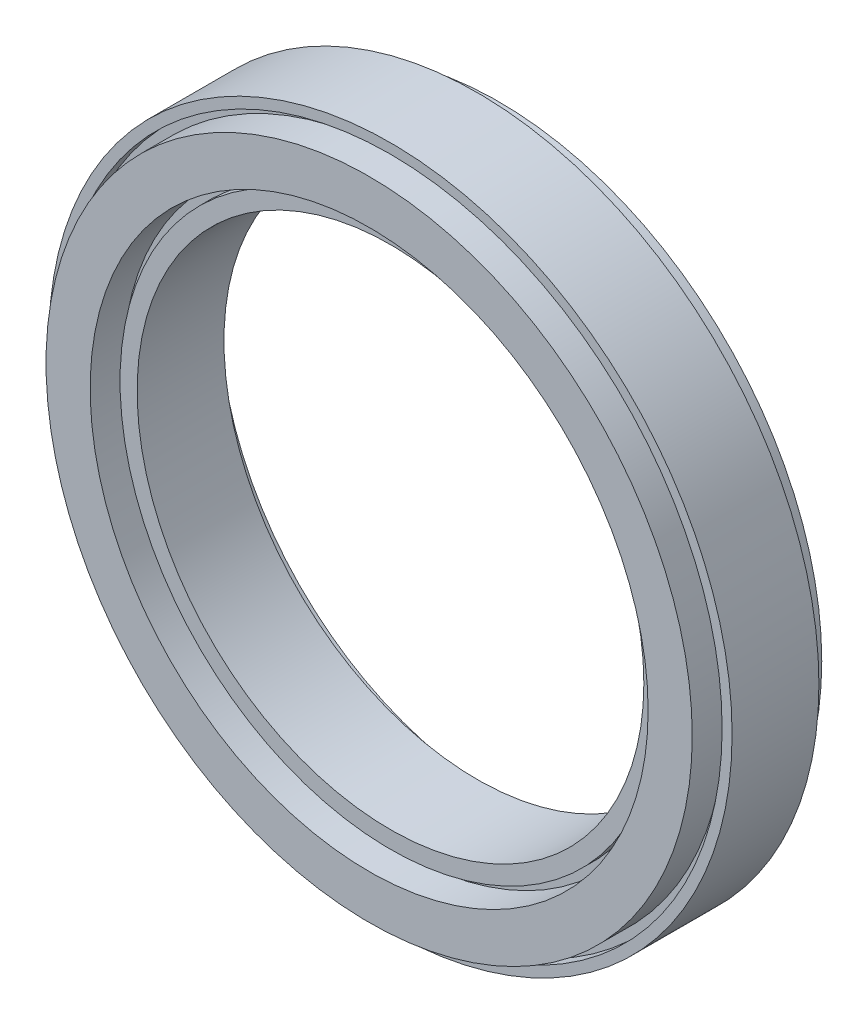
ISO-10303-21;
HEADER;
FILE_DESCRIPTION(('STEP AP214'),'2;1');
FILE_NAME('part.step','',(''),(''),'','','');
FILE_SCHEMA(('AUTOMOTIVE_DESIGN { 1 0 10303 214 1 1 1 1 }'));
ENDSEC;
DATA;
#1=APPLICATION_CONTEXT('core data for automotive mechanical design processes');
#2=APPLICATION_PROTOCOL_DEFINITION('international standard','automotive_design',2000,#1);
#3=PRODUCT_CONTEXT('',#1,'mechanical');
#4=PRODUCT('Part','Part','',(#3));
#5=PRODUCT_RELATED_PRODUCT_CATEGORY('part','',(#4));
#6=PRODUCT_DEFINITION_FORMATION('','',#4);
#7=PRODUCT_DEFINITION_CONTEXT('part definition',#1,'design');
#8=PRODUCT_DEFINITION('design','',#6,#7);
#9=PRODUCT_DEFINITION_SHAPE('','',#8);
#10=(LENGTH_UNIT() NAMED_UNIT(*) SI_UNIT(.MILLI.,.METRE.));
#11=(NAMED_UNIT(*) PLANE_ANGLE_UNIT() SI_UNIT($,.RADIAN.));
#12=(NAMED_UNIT(*) SI_UNIT($,.STERADIAN.) SOLID_ANGLE_UNIT());
#13=UNCERTAINTY_MEASURE_WITH_UNIT(LENGTH_MEASURE(1.E-05),#10,'distance_accuracy_value','');
#14=(GEOMETRIC_REPRESENTATION_CONTEXT(3) GLOBAL_UNCERTAINTY_ASSIGNED_CONTEXT((#13)) GLOBAL_UNIT_ASSIGNED_CONTEXT((#10,
#11,#12)) REPRESENTATION_CONTEXT('',''));
#15=CARTESIAN_POINT('',(0.,0.,0.));
#16=DIRECTION('',(0.,0.,1.));
#17=DIRECTION('',(1.,0.,0.));
#18=AXIS2_PLACEMENT_3D('',#15,#16,#17);
#19=CARTESIAN_POINT('',(0.,0.,-2.25));
#20=DIRECTION('',(0.,0.,-1.));
#21=DIRECTION('',(1.,0.,0.));
#22=AXIS2_PLACEMENT_3D('',#19,#20,#21);
#23=PLANE('',#22);
#24=CARTESIAN_POINT('',(0.,0.,-2.25));
#25=DIRECTION('',(0.,0.,1.));
#26=DIRECTION('',(1.,0.,0.));
#27=AXIS2_PLACEMENT_3D('',#24,#25,#26);
#28=CIRCLE('',#27,19.);
#29=CARTESIAN_POINT('',(19.,0.,-2.25));
#30=VERTEX_POINT('',#29);
#31=EDGE_CURVE('E84',#30,#30,#28,.T.);
#32=ORIENTED_EDGE('',*,*,#31,.T.);
#33=EDGE_LOOP('',(#32));
#34=FACE_BOUND('',#33,.T.);
#35=CARTESIAN_POINT('',(0.,0.,-2.25));
#36=DIRECTION('',(0.,0.,1.));
#37=DIRECTION('',(1.,0.,0.));
#38=AXIS2_PLACEMENT_3D('',#35,#36,#37);
#39=CIRCLE('',#38,19.6);
#40=CARTESIAN_POINT('',(19.6,0.,-2.25));
#41=VERTEX_POINT('',#40);
#42=EDGE_CURVE('E96',#41,#41,#39,.T.);
#43=ORIENTED_EDGE('',*,*,#42,.F.);
#44=EDGE_LOOP('',(#43));
#45=FACE_BOUND('',#44,.T.);
#46=ADVANCED_FACE('F33',(#34,#45),#23,.T.);
#47=CARTESIAN_POINT('',(0.,0.,-3.05));
#48=DIRECTION('',(0.,0.,1.));
#49=DIRECTION('',(1.,0.,0.));
#50=AXIS2_PLACEMENT_3D('',#47,#48,#49);
#51=PLANE('',#50);
#52=CARTESIAN_POINT('',(0.,0.,-3.05));
#53=DIRECTION('',(0.,0.,1.));
#54=DIRECTION('',(1.,0.,0.));
#55=AXIS2_PLACEMENT_3D('',#52,#53,#54);
#56=CIRCLE('',#55,17.8);
#57=CARTESIAN_POINT('',(17.8,0.,-3.05));
#58=VERTEX_POINT('',#57);
#59=EDGE_CURVE('E54',#58,#58,#56,.T.);
#60=ORIENTED_EDGE('',*,*,#59,.T.);
#61=EDGE_LOOP('',(#60));
#62=FACE_BOUND('',#61,.T.);
#63=CARTESIAN_POINT('',(0.,0.,-3.05));
#64=DIRECTION('',(0.,0.,1.));
#65=DIRECTION('',(1.,0.,0.));
#66=AXIS2_PLACEMENT_3D('',#63,#64,#65);
#67=CIRCLE('',#66,19.);
#68=CARTESIAN_POINT('',(19.,0.,-3.05));
#69=VERTEX_POINT('',#68);
#70=EDGE_CURVE('E87',#69,#69,#67,.T.);
#71=ORIENTED_EDGE('',*,*,#70,.F.);
#72=EDGE_LOOP('',(#71));
#73=FACE_BOUND('',#72,.T.);
#74=ADVANCED_FACE('F112',(#62,#73),#51,.F.);
#75=CARTESIAN_POINT('',(0.,0.,2.25));
#76=DIRECTION('',(0.,0.,1.));
#77=DIRECTION('',(1.,0.,0.));
#78=AXIS2_PLACEMENT_3D('',#75,#76,#77);
#79=PLANE('',#78);
#80=CARTESIAN_POINT('',(0.,0.,2.25));
#81=DIRECTION('',(0.,0.,1.));
#82=DIRECTION('',(1.,0.,0.));
#83=AXIS2_PLACEMENT_3D('',#80,#81,#82);
#84=CIRCLE('',#83,19.);
#85=CARTESIAN_POINT('',(19.,0.,2.25));
#86=VERTEX_POINT('',#85);
#87=EDGE_CURVE('E63',#86,#86,#84,.T.);
#88=ORIENTED_EDGE('',*,*,#87,.F.);
#89=EDGE_LOOP('',(#88));
#90=FACE_BOUND('',#89,.T.);
#91=CARTESIAN_POINT('',(0.,0.,2.25));
#92=DIRECTION('',(0.,0.,1.));
#93=DIRECTION('',(1.,0.,0.));
#94=AXIS2_PLACEMENT_3D('',#91,#92,#93);
#95=CIRCLE('',#94,19.6);
#96=CARTESIAN_POINT('',(19.6,0.,2.25));
#97=VERTEX_POINT('',#96);
#98=EDGE_CURVE('E40',#97,#97,#95,.F.);
#99=ORIENTED_EDGE('',*,*,#98,.F.);
#100=EDGE_LOOP('',(#99));
#101=FACE_BOUND('',#100,.T.);
#102=ADVANCED_FACE('F119',(#90,#101),#79,.T.);
#103=CARTESIAN_POINT('',(0.,0.,3.05));
#104=DIRECTION('',(0.,0.,1.));
#105=DIRECTION('',(1.,0.,0.));
#106=AXIS2_PLACEMENT_3D('',#103,#104,#105);
#107=PLANE('',#106);
#108=CARTESIAN_POINT('',(0.,0.,3.05));
#109=DIRECTION('',(0.,0.,1.));
#110=DIRECTION('',(1.,0.,0.));
#111=AXIS2_PLACEMENT_3D('',#108,#109,#110);
#112=CIRCLE('',#111,17.8);
#113=CARTESIAN_POINT('',(17.8,0.,3.05));
#114=VERTEX_POINT('',#113);
#115=EDGE_CURVE('E52',#114,#114,#112,.T.);
#116=ORIENTED_EDGE('',*,*,#115,.F.);
#117=EDGE_LOOP('',(#116));
#118=FACE_BOUND('',#117,.T.);
#119=CARTESIAN_POINT('',(0.,0.,3.05));
#120=DIRECTION('',(0.,0.,1.));
#121=DIRECTION('',(1.,0.,0.));
#122=AXIS2_PLACEMENT_3D('',#119,#120,#121);
#123=CIRCLE('',#122,19.);
#124=CARTESIAN_POINT('',(19.,0.,3.05));
#125=VERTEX_POINT('',#124);
#126=EDGE_CURVE('E66',#125,#125,#123,.T.);
#127=ORIENTED_EDGE('',*,*,#126,.T.);
#128=EDGE_LOOP('',(#127));
#129=FACE_BOUND('',#128,.T.);
#130=ADVANCED_FACE('F159',(#118,#129),#107,.T.);
#131=CARTESIAN_POINT('',(0.,0.,3.05));
#132=DIRECTION('',(0.,0.,1.));
#133=DIRECTION('',(1.,0.,0.));
#134=AXIS2_PLACEMENT_3D('',#131,#132,#133);
#135=CIRCLE('',#134,23.3);
#136=CARTESIAN_POINT('',(23.3,0.,3.05));
#137=VERTEX_POINT('',#136);
#138=EDGE_CURVE('E60',#137,#137,#135,.T.);
#139=ORIENTED_EDGE('',*,*,#138,.F.);
#140=EDGE_LOOP('',(#139));
#141=FACE_BOUND('',#140,.T.);
#142=CARTESIAN_POINT('',(0.,0.,3.05));
#143=DIRECTION('',(0.,0.,1.));
#144=DIRECTION('',(1.,0.,0.));
#145=AXIS2_PLACEMENT_3D('',#142,#143,#144);
#146=CIRCLE('',#145,24.);
#147=CARTESIAN_POINT('',(24.,0.,3.05));
#148=VERTEX_POINT('',#147);
#149=EDGE_CURVE('E44',#148,#148,#146,.T.);
#150=ORIENTED_EDGE('',*,*,#149,.T.);
#151=EDGE_LOOP('',(#150));
#152=FACE_BOUND('',#151,.T.);
#153=ADVANCED_FACE('F144',(#141,#152),#107,.T.);
#154=CARTESIAN_POINT('',(0.,0.,-3.05));
#155=DIRECTION('',(0.,0.,1.));
#156=DIRECTION('',(1.,0.,0.));
#157=AXIS2_PLACEMENT_3D('',#154,#155,#156);
#158=CIRCLE('',#157,23.3);
#159=CARTESIAN_POINT('',(23.3,0.,-3.05));
#160=VERTEX_POINT('',#159);
#161=EDGE_CURVE('E81',#160,#160,#158,.T.);
#162=ORIENTED_EDGE('',*,*,#161,.T.);
#163=EDGE_LOOP('',(#162));
#164=FACE_BOUND('',#163,.T.);
#165=CARTESIAN_POINT('',(0.,0.,-3.05));
#166=DIRECTION('',(0.,0.,1.));
#167=DIRECTION('',(1.,0.,0.));
#168=AXIS2_PLACEMENT_3D('',#165,#166,#167);
#169=CIRCLE('',#168,24.);
#170=CARTESIAN_POINT('',(24.,0.,-3.05));
#171=VERTEX_POINT('',#170);
#172=EDGE_CURVE('E48',#171,#171,#169,.T.);
#173=ORIENTED_EDGE('',*,*,#172,.F.);
#174=EDGE_LOOP('',(#173));
#175=FACE_BOUND('',#174,.T.);
#176=ADVANCED_FACE('F121',(#164,#175),#51,.F.);
#177=CARTESIAN_POINT('',(0.,0.,3.05));
#178=DIRECTION('',(0.,0.,-1.));
#179=DIRECTION('',(-1.,0.,0.));
#180=AXIS2_PLACEMENT_3D('',#177,#178,#179);
#181=CYLINDRICAL_SURFACE('',#180,24.);
#182=ORIENTED_EDGE('',*,*,#149,.F.);
#183=EDGE_LOOP('',(#182));
#184=FACE_BOUND('',#183,.T.);
#185=ORIENTED_EDGE('',*,*,#172,.T.);
#186=EDGE_LOOP('',(#185));
#187=FACE_BOUND('',#186,.T.);
#188=ADVANCED_FACE('F35',(#184,#187),#181,.T.);
#189=CARTESIAN_POINT('',(0.,0.,3.05));
#190=DIRECTION('',(0.,0.,-1.));
#191=DIRECTION('',(-1.,0.,0.));
#192=AXIS2_PLACEMENT_3D('',#189,#190,#191);
#193=CYLINDRICAL_SURFACE('',#192,17.8);
#194=ORIENTED_EDGE('',*,*,#115,.T.);
#195=EDGE_LOOP('',(#194));
#196=FACE_BOUND('',#195,.T.);
#197=ORIENTED_EDGE('',*,*,#59,.F.);
#198=EDGE_LOOP('',(#197));
#199=FACE_BOUND('',#198,.T.);
#200=ADVANCED_FACE('F148',(#196,#199),#193,.F.);
#201=CARTESIAN_POINT('',(0.,0.,2.25));
#202=DIRECTION('',(0.,0.,1.));
#203=DIRECTION('',(1.,0.,0.));
#204=AXIS2_PLACEMENT_3D('',#201,#202,#203);
#205=CYLINDRICAL_SURFACE('',#204,23.3);
#206=CARTESIAN_POINT('',(0.,0.,2.25));
#207=DIRECTION('',(0.,0.,1.));
#208=DIRECTION('',(1.,0.,0.));
#209=AXIS2_PLACEMENT_3D('',#206,#207,#208);
#210=CIRCLE('',#209,23.3);
#211=CARTESIAN_POINT('',(23.3,0.,2.25));
#212=VERTEX_POINT('',#211);
#213=EDGE_CURVE('E57',#212,#212,#210,.T.);
#214=ORIENTED_EDGE('',*,*,#213,.F.);
#215=EDGE_LOOP('',(#214));
#216=FACE_BOUND('',#215,.T.);
#217=ORIENTED_EDGE('',*,*,#138,.T.);
#218=EDGE_LOOP('',(#217));
#219=FACE_BOUND('',#218,.T.);
#220=ADVANCED_FACE('F153',(#216,#219),#205,.F.);
#221=CARTESIAN_POINT('',(0.,0.,2.25));
#222=DIRECTION('',(0.,0.,1.));
#223=DIRECTION('',(1.,0.,0.));
#224=AXIS2_PLACEMENT_3D('',#221,#222,#223);
#225=CIRCLE('',#224,22.7);
#226=CARTESIAN_POINT('',(22.7,0.,2.25));
#227=VERTEX_POINT('',#226);
#228=EDGE_CURVE('E72',#227,#227,#225,.T.);
#229=ORIENTED_EDGE('',*,*,#228,.F.);
#230=EDGE_LOOP('',(#229));
#231=FACE_BOUND('',#230,.T.);
#232=ORIENTED_EDGE('',*,*,#213,.T.);
#233=EDGE_LOOP('',(#232));
#234=FACE_BOUND('',#233,.T.);
#235=ADVANCED_FACE('F170',(#231,#234),#79,.T.);
#236=CARTESIAN_POINT('',(0.,0.,2.25));
#237=DIRECTION('',(0.,0.,1.));
#238=DIRECTION('',(1.,0.,0.));
#239=AXIS2_PLACEMENT_3D('',#236,#237,#238);
#240=CYLINDRICAL_SURFACE('',#239,19.);
#241=ORIENTED_EDGE('',*,*,#87,.T.);
#242=EDGE_LOOP('',(#241));
#243=FACE_BOUND('',#242,.T.);
#244=ORIENTED_EDGE('',*,*,#126,.F.);
#245=EDGE_LOOP('',(#244));
#246=FACE_BOUND('',#245,.T.);
#247=ADVANCED_FACE('F174',(#243,#246),#240,.T.);
#248=CARTESIAN_POINT('',(0.,0.,4.55));
#249=DIRECTION('',(0.,0.,1.));
#250=DIRECTION('',(1.,0.,0.));
#251=AXIS2_PLACEMENT_3D('',#248,#249,#250);
#252=PLANE('',#251);
#253=CARTESIAN_POINT('',(0.,0.,4.55));
#254=DIRECTION('',(0.,0.,1.));
#255=DIRECTION('',(1.,0.,0.));
#256=AXIS2_PLACEMENT_3D('',#253,#254,#255);
#257=CIRCLE('',#256,22.7);
#258=CARTESIAN_POINT('',(22.7,0.,4.55));
#259=VERTEX_POINT('',#258);
#260=EDGE_CURVE('E69',#259,#259,#257,.T.);
#261=ORIENTED_EDGE('',*,*,#260,.T.);
#262=EDGE_LOOP('',(#261));
#263=FACE_BOUND('',#262,.T.);
#264=CARTESIAN_POINT('',(0.,0.,4.55));
#265=DIRECTION('',(0.,0.,1.));
#266=DIRECTION('',(1.,0.,0.));
#267=AXIS2_PLACEMENT_3D('',#264,#265,#266);
#268=CIRCLE('',#267,19.6);
#269=CARTESIAN_POINT('',(19.6,0.,4.55));
#270=VERTEX_POINT('',#269);
#271=EDGE_CURVE('E75',#270,#270,#268,.T.);
#272=ORIENTED_EDGE('',*,*,#271,.F.);
#273=EDGE_LOOP('',(#272));
#274=FACE_BOUND('',#273,.T.);
#275=ADVANCED_FACE('F178',(#263,#274),#252,.T.);
#276=CARTESIAN_POINT('',(0.,0.,4.55));
#277=DIRECTION('',(0.,0.,-1.));
#278=DIRECTION('',(-1.,0.,0.));
#279=AXIS2_PLACEMENT_3D('',#276,#277,#278);
#280=CYLINDRICAL_SURFACE('',#279,22.7);
#281=ORIENTED_EDGE('',*,*,#260,.F.);
#282=EDGE_LOOP('',(#281));
#283=FACE_BOUND('',#282,.T.);
#284=ORIENTED_EDGE('',*,*,#228,.T.);
#285=EDGE_LOOP('',(#284));
#286=FACE_BOUND('',#285,.T.);
#287=ADVANCED_FACE('F134',(#283,#286),#280,.T.);
#288=CARTESIAN_POINT('',(0.,0.,4.55));
#289=DIRECTION('',(0.,0.,-1.));
#290=DIRECTION('',(-1.,0.,0.));
#291=AXIS2_PLACEMENT_3D('',#288,#289,#290);
#292=CYLINDRICAL_SURFACE('',#291,19.6);
#293=ORIENTED_EDGE('',*,*,#271,.T.);
#294=EDGE_LOOP('',(#293));
#295=FACE_BOUND('',#294,.T.);
#296=ORIENTED_EDGE('',*,*,#98,.T.);
#297=EDGE_LOOP('',(#296));
#298=FACE_BOUND('',#297,.T.);
#299=ADVANCED_FACE('F126',(#295,#298),#292,.F.);
#300=CARTESIAN_POINT('',(0.,0.,-2.25));
#301=DIRECTION('',(0.,0.,-1.));
#302=DIRECTION('',(-1.,0.,0.));
#303=AXIS2_PLACEMENT_3D('',#300,#301,#302);
#304=CIRCLE('',#303,22.7);
#305=CARTESIAN_POINT('',(-22.7,0.,-2.25));
#306=VERTEX_POINT('',#305);
#307=EDGE_CURVE('E10',#306,#306,#304,.T.);
#308=ORIENTED_EDGE('',*,*,#307,.F.);
#309=EDGE_LOOP('',(#308));
#310=FACE_BOUND('',#309,.T.);
#311=CARTESIAN_POINT('',(0.,0.,-2.25));
#312=DIRECTION('',(0.,0.,1.));
#313=DIRECTION('',(1.,0.,0.));
#314=AXIS2_PLACEMENT_3D('',#311,#312,#313);
#315=CIRCLE('',#314,23.3);
#316=CARTESIAN_POINT('',(23.3,0.,-2.25));
#317=VERTEX_POINT('',#316);
#318=EDGE_CURVE('E80',#317,#317,#315,.T.);
#319=ORIENTED_EDGE('',*,*,#318,.F.);
#320=EDGE_LOOP('',(#319));
#321=FACE_BOUND('',#320,.T.);
#322=ADVANCED_FACE('F115',(#310,#321),#23,.T.);
#323=CARTESIAN_POINT('',(0.,0.,-2.25));
#324=DIRECTION('',(0.,0.,-1.));
#325=DIRECTION('',(-1.,0.,0.));
#326=AXIS2_PLACEMENT_3D('',#323,#324,#325);
#327=CYLINDRICAL_SURFACE('',#326,23.3);
#328=ORIENTED_EDGE('',*,*,#318,.T.);
#329=EDGE_LOOP('',(#328));
#330=FACE_BOUND('',#329,.T.);
#331=ORIENTED_EDGE('',*,*,#161,.F.);
#332=EDGE_LOOP('',(#331));
#333=FACE_BOUND('',#332,.T.);
#334=ADVANCED_FACE('F125',(#330,#333),#327,.F.);
#335=CARTESIAN_POINT('',(0.,0.,-2.25));
#336=DIRECTION('',(0.,0.,-1.));
#337=DIRECTION('',(-1.,0.,0.));
#338=AXIS2_PLACEMENT_3D('',#335,#336,#337);
#339=CYLINDRICAL_SURFACE('',#338,19.);
#340=ORIENTED_EDGE('',*,*,#31,.F.);
#341=EDGE_LOOP('',(#340));
#342=FACE_BOUND('',#341,.T.);
#343=ORIENTED_EDGE('',*,*,#70,.T.);
#344=EDGE_LOOP('',(#343));
#345=FACE_BOUND('',#344,.T.);
#346=ADVANCED_FACE('F132',(#342,#345),#339,.T.);
#347=CARTESIAN_POINT('',(0.,0.,-4.55));
#348=DIRECTION('',(0.,0.,1.));
#349=DIRECTION('',(1.,0.,0.));
#350=AXIS2_PLACEMENT_3D('',#347,#348,#349);
#351=CYLINDRICAL_SURFACE('',#350,22.7);
#352=CARTESIAN_POINT('',(0.,0.,-4.55));
#353=DIRECTION('',(0.,0.,1.));
#354=DIRECTION('',(1.,0.,0.));
#355=AXIS2_PLACEMENT_3D('',#352,#353,#354);
#356=CIRCLE('',#355,22.7);
#357=CARTESIAN_POINT('',(22.7,0.,-4.55));
#358=VERTEX_POINT('',#357);
#359=EDGE_CURVE('E90',#358,#358,#356,.T.);
#360=ORIENTED_EDGE('',*,*,#359,.T.);
#361=EDGE_LOOP('',(#360));
#362=FACE_BOUND('',#361,.T.);
#363=ORIENTED_EDGE('',*,*,#307,.T.);
#364=EDGE_LOOP('',(#363));
#365=FACE_BOUND('',#364,.T.);
#366=ADVANCED_FACE('F245',(#362,#365),#351,.T.);
#367=CARTESIAN_POINT('',(0.,0.,-4.55));
#368=DIRECTION('',(0.,0.,-1.));
#369=DIRECTION('',(1.,0.,0.));
#370=AXIS2_PLACEMENT_3D('',#367,#368,#369);
#371=PLANE('',#370);
#372=CARTESIAN_POINT('',(0.,0.,-4.55));
#373=DIRECTION('',(0.,0.,1.));
#374=DIRECTION('',(1.,0.,0.));
#375=AXIS2_PLACEMENT_3D('',#372,#373,#374);
#376=CIRCLE('',#375,19.6);
#377=CARTESIAN_POINT('',(19.6,0.,-4.55));
#378=VERTEX_POINT('',#377);
#379=EDGE_CURVE('E95',#378,#378,#376,.T.);
#380=ORIENTED_EDGE('',*,*,#379,.T.);
#381=EDGE_LOOP('',(#380));
#382=FACE_BOUND('',#381,.T.);
#383=ORIENTED_EDGE('',*,*,#359,.F.);
#384=EDGE_LOOP('',(#383));
#385=FACE_BOUND('',#384,.T.);
#386=ADVANCED_FACE('F102',(#382,#385),#371,.T.);
#387=CARTESIAN_POINT('',(0.,0.,-4.55));
#388=DIRECTION('',(0.,0.,1.));
#389=DIRECTION('',(1.,0.,0.));
#390=AXIS2_PLACEMENT_3D('',#387,#388,#389);
#391=CYLINDRICAL_SURFACE('',#390,19.6);
#392=ORIENTED_EDGE('',*,*,#379,.F.);
#393=EDGE_LOOP('',(#392));
#394=FACE_BOUND('',#393,.T.);
#395=ORIENTED_EDGE('',*,*,#42,.T.);
#396=EDGE_LOOP('',(#395));
#397=FACE_BOUND('',#396,.T.);
#398=ADVANCED_FACE('F105',(#394,#397),#391,.F.);
#399=CLOSED_SHELL('',(#46,#74,#102,#130,#153,#176,#188,#200,#220,#235,#247,#275,#287,#299,#322,
#334,#346,#366,#386,#398));
#400=MANIFOLD_SOLID_BREP('B2',#399);
#401=ADVANCED_BREP_SHAPE_REPRESENTATION('',(#18,#400),#14);
#402=SHAPE_DEFINITION_REPRESENTATION(#9,#401);
ENDSEC;
END-ISO-10303-21;
